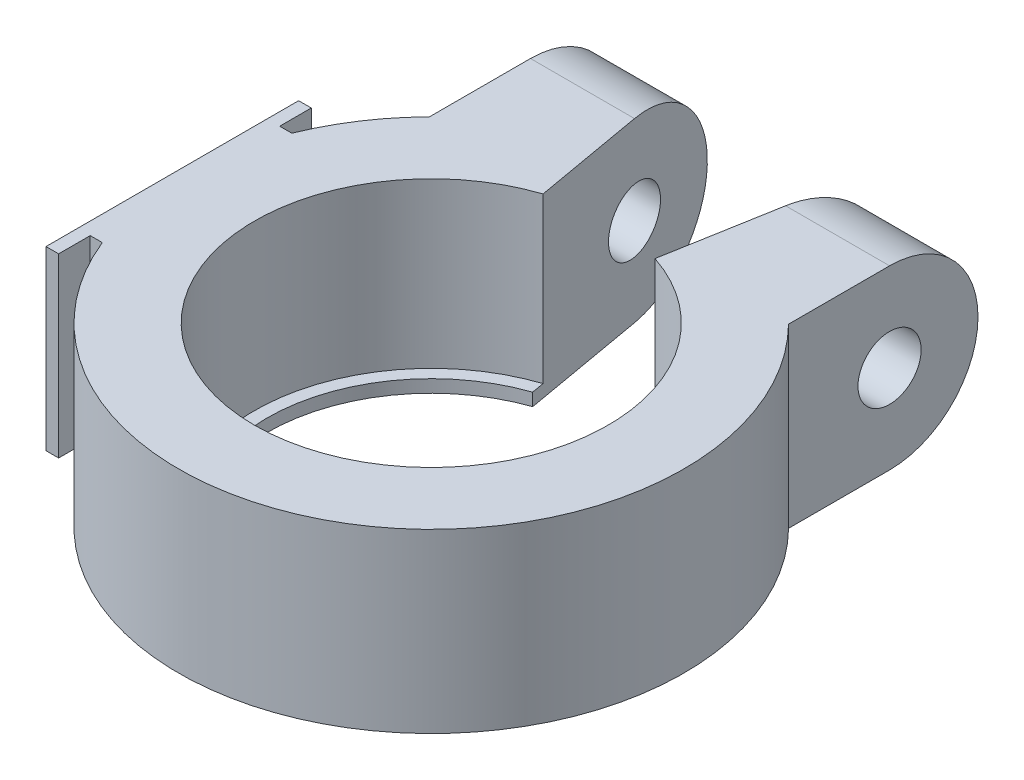
ISO-10303-21;
HEADER;
FILE_DESCRIPTION(('STEP AP214'),'2;1');
FILE_NAME('part.step','',(''),(''),'','','');
FILE_SCHEMA(('AUTOMOTIVE_DESIGN { 1 0 10303 214 1 1 1 1 }'));
ENDSEC;
DATA;
#1=APPLICATION_CONTEXT('core data for automotive mechanical design processes');
#2=APPLICATION_PROTOCOL_DEFINITION('international standard','automotive_design',2000,#1);
#3=PRODUCT_CONTEXT('',#1,'mechanical');
#4=PRODUCT('Part','Part','',(#3));
#5=PRODUCT_RELATED_PRODUCT_CATEGORY('part','',(#4));
#6=PRODUCT_DEFINITION_FORMATION('','',#4);
#7=PRODUCT_DEFINITION_CONTEXT('part definition',#1,'design');
#8=PRODUCT_DEFINITION('design','',#6,#7);
#9=PRODUCT_DEFINITION_SHAPE('','',#8);
#10=(LENGTH_UNIT() NAMED_UNIT(*) SI_UNIT(.MILLI.,.METRE.));
#11=(NAMED_UNIT(*) PLANE_ANGLE_UNIT() SI_UNIT($,.RADIAN.));
#12=(NAMED_UNIT(*) SI_UNIT($,.STERADIAN.) SOLID_ANGLE_UNIT());
#13=UNCERTAINTY_MEASURE_WITH_UNIT(LENGTH_MEASURE(1.E-05),#10,'distance_accuracy_value','');
#14=(GEOMETRIC_REPRESENTATION_CONTEXT(3) GLOBAL_UNCERTAINTY_ASSIGNED_CONTEXT((#13)) GLOBAL_UNIT_ASSIGNED_CONTEXT((#10,
#11,#12)) REPRESENTATION_CONTEXT('',''));
#15=CARTESIAN_POINT('',(0.,0.,0.));
#16=DIRECTION('',(0.,0.,1.));
#17=DIRECTION('',(1.,0.,0.));
#18=AXIS2_PLACEMENT_3D('',#15,#16,#17);
#19=CARTESIAN_POINT('',(0.,14.,0.));
#20=DIRECTION('',(0.,-1.,0.));
#21=DIRECTION('',(0.,0.,-1.));
#22=AXIS2_PLACEMENT_3D('',#19,#20,#21);
#23=CYLINDRICAL_SURFACE('',#22,13.);
#24=CARTESIAN_POINT('',(0.,1.,0.));
#25=DIRECTION('',(0.,1.,0.));
#26=DIRECTION('',(0.,0.,1.));
#27=AXIS2_PLACEMENT_3D('',#24,#25,#26);
#28=CIRCLE('',#27,13.);
#29=CARTESIAN_POINT('',(4.25438035283981,1.,-12.284146197981));
#30=VERTEX_POINT('',#29);
#31=CARTESIAN_POINT('',(-4.25438035283981,1.,-12.284146197981));
#32=VERTEX_POINT('',#31);
#33=EDGE_CURVE('E296',#30,#32,#28,.F.);
#34=ORIENTED_EDGE('',*,*,#33,.F.);
#35=DIRECTION('',(0.,-1.,0.));
#36=VECTOR('',#35,1.);
#37=CARTESIAN_POINT('',(4.25438035283981,14.,-12.284146197981));
#38=LINE('',#37,#36);
#39=CARTESIAN_POINT('',(4.25438035283981,0.,-12.284146197981));
#40=VERTEX_POINT('',#39);
#41=EDGE_CURVE('E194',#30,#40,#38,.T.);
#42=ORIENTED_EDGE('',*,*,#41,.T.);
#43=CARTESIAN_POINT('',(0.,0.,0.));
#44=DIRECTION('',(0.,-1.,0.));
#45=DIRECTION('',(0.,0.,1.));
#46=AXIS2_PLACEMENT_3D('',#43,#44,#45);
#47=CIRCLE('',#46,13.);
#48=CARTESIAN_POINT('',(-4.25438035283981,0.,-12.284146197981));
#49=VERTEX_POINT('',#48);
#50=EDGE_CURVE('E303',#40,#49,#47,.T.);
#51=ORIENTED_EDGE('',*,*,#50,.T.);
#52=DIRECTION('',(0.,-1.,0.));
#53=VECTOR('',#52,1.);
#54=CARTESIAN_POINT('',(-4.25438035283981,14.,-12.284146197981));
#55=LINE('',#54,#53);
#56=EDGE_CURVE('E249',#32,#49,#55,.T.);
#57=ORIENTED_EDGE('',*,*,#56,.F.);
#58=EDGE_LOOP('',(#34,#42,#51,#57));
#59=FACE_BOUND('',#58,.T.);
#60=ADVANCED_FACE('F47',(#59),#23,.F.);
#61=CARTESIAN_POINT('',(-5.97984896225347,7.,-22.0697649528697));
#62=DIRECTION('',(-1.,0.,0.));
#63=DIRECTION('',(0.,0.,1.));
#64=AXIS2_PLACEMENT_3D('',#61,#62,#63);
#65=CYLINDRICAL_SURFACE('',#64,7.);
#66=DIRECTION('',(1.,0.,0.));
#67=VECTOR('',#66,1.);
#68=CARTESIAN_POINT('',(-5.97984896225347,14.,-22.0697649528697));
#69=LINE('',#68,#67);
#70=CARTESIAN_POINT('',(-5.97984896225347,14.,-22.0697649528697));
#71=VERTEX_POINT('',#70);
#72=CARTESIAN_POINT('',(-14.2141378272127,14.,-22.0697649528697));
#73=VERTEX_POINT('',#72);
#74=EDGE_CURVE('E266',#71,#73,#69,.F.);
#75=ORIENTED_EDGE('',*,*,#74,.F.);
#76=CARTESIAN_POINT('',(-5.97984896225347,7.,-22.0697649528697));
#77=DIRECTION('',(-0.984807753012208,0.,0.173648177666931));
#78=DIRECTION('',(-0.173648177666931,0.,-0.984807753012208));
#79=AXIS2_PLACEMENT_3D('',#76,#77,#78);
#80=ELLIPSE('',#79,7.10798628320021,7.);
#81=CARTESIAN_POINT('',(-5.97984896225347,0.,-22.0697649528697));
#82=VERTEX_POINT('',#81);
#83=EDGE_CURVE('E72',#82,#71,#80,.F.);
#84=ORIENTED_EDGE('',*,*,#83,.F.);
#85=DIRECTION('',(-1.,0.,0.));
#86=VECTOR('',#85,1.);
#87=CARTESIAN_POINT('',(0.,0.,-22.0697649528697));
#88=LINE('',#87,#86);
#89=CARTESIAN_POINT('',(-14.2141378272127,0.,-22.0697649528697));
#90=VERTEX_POINT('',#89);
#91=EDGE_CURVE('E270',#90,#82,#88,.F.);
#92=ORIENTED_EDGE('',*,*,#91,.F.);
#93=CARTESIAN_POINT('',(-14.2141378272127,7.,-22.0697649528697));
#94=DIRECTION('',(1.,0.,0.));
#95=DIRECTION('',(0.,0.,-1.));
#96=AXIS2_PLACEMENT_3D('',#93,#94,#95);
#97=CIRCLE('',#96,7.);
#98=EDGE_CURVE('E275',#73,#90,#97,.F.);
#99=ORIENTED_EDGE('',*,*,#98,.F.);
#100=EDGE_LOOP('',(#75,#84,#92,#99));
#101=FACE_BOUND('',#100,.T.);
#102=ADVANCED_FACE('F50',(#101),#65,.T.);
#103=CARTESIAN_POINT('',(14.2141378272127,7.,-22.0697649528697));
#104=DIRECTION('',(-1.,0.,0.));
#105=DIRECTION('',(0.,0.,1.));
#106=AXIS2_PLACEMENT_3D('',#103,#104,#105);
#107=CYLINDRICAL_SURFACE('',#106,7.);
#108=DIRECTION('',(1.,0.,0.));
#109=VECTOR('',#108,1.);
#110=CARTESIAN_POINT('',(14.2141378272127,14.,-22.0697649528697));
#111=LINE('',#110,#109);
#112=CARTESIAN_POINT('',(14.2141378272127,14.,-22.0697649528697));
#113=VERTEX_POINT('',#112);
#114=CARTESIAN_POINT('',(5.97984896225347,14.,-22.0697649528697));
#115=VERTEX_POINT('',#114);
#116=EDGE_CURVE('E252',#113,#115,#111,.F.);
#117=ORIENTED_EDGE('',*,*,#116,.F.);
#118=CARTESIAN_POINT('',(14.2141378272127,7.,-22.0697649528697));
#119=DIRECTION('',(-1.,0.,0.));
#120=DIRECTION('',(0.,0.,1.));
#121=AXIS2_PLACEMENT_3D('',#118,#119,#120);
#122=CIRCLE('',#121,7.);
#123=CARTESIAN_POINT('',(14.2141378272127,0.,-22.0697649528697));
#124=VERTEX_POINT('',#123);
#125=EDGE_CURVE('E260',#124,#113,#122,.F.);
#126=ORIENTED_EDGE('',*,*,#125,.F.);
#127=DIRECTION('',(-1.,0.,0.));
#128=VECTOR('',#127,1.);
#129=CARTESIAN_POINT('',(0.,0.,-22.0697649528697));
#130=LINE('',#129,#128);
#131=CARTESIAN_POINT('',(5.97984896225347,0.,-22.0697649528697));
#132=VERTEX_POINT('',#131);
#133=EDGE_CURVE('E256',#132,#124,#130,.F.);
#134=ORIENTED_EDGE('',*,*,#133,.F.);
#135=CARTESIAN_POINT('',(5.97984896225347,7.,-22.0697649528697));
#136=DIRECTION('',(0.984807753012208,0.,0.173648177666931));
#137=DIRECTION('',(-0.173648177666931,0.,0.984807753012208));
#138=AXIS2_PLACEMENT_3D('',#135,#136,#137);
#139=ELLIPSE('',#138,7.10798628320021,7.);
#140=EDGE_CURVE('E263',#115,#132,#139,.F.);
#141=ORIENTED_EDGE('',*,*,#140,.F.);
#142=EDGE_LOOP('',(#117,#126,#134,#141));
#143=FACE_BOUND('',#142,.T.);
#144=ADVANCED_FACE('F392',(#143),#107,.T.);
#145=CARTESIAN_POINT('',(-4.25438035283981,14.,-12.284146197981));
#146=DIRECTION('',(-0.984807753012208,0.,0.173648177666931));
#147=DIRECTION('',(0.173648177666931,0.,0.984807753012208));
#148=AXIS2_PLACEMENT_3D('',#145,#146,#147);
#149=PLANE('',#148);
#150=CARTESIAN_POINT('',(-5.97984896225347,7.,-22.0697649528697));
#151=DIRECTION('',(-0.984807753012208,0.,0.173648177666931));
#152=DIRECTION('',(-0.173648177666931,0.,-0.984807753012208));
#153=AXIS2_PLACEMENT_3D('',#150,#151,#152);
#154=ELLIPSE('',#153,2.53856652971436,2.5);
#155=CARTESIAN_POINT('',(-6.42066641402464,7.,-24.5697649528697));
#156=VERTEX_POINT('',#155);
#157=EDGE_CURVE('E289',#156,#156,#154,.T.);
#158=ORIENTED_EDGE('',*,*,#157,.T.);
#159=EDGE_LOOP('',(#158));
#160=FACE_BOUND('',#159,.T.);
#161=DIRECTION('',(-0.173648177666931,0.,-0.984807753012208));
#162=VECTOR('',#161,1.);
#163=CARTESIAN_POINT('',(-4.25438035283981,14.,-12.284146197981));
#164=LINE('',#163,#162);
#165=CARTESIAN_POINT('',(-4.43008227345805,14.,-13.2806013060551));
#166=VERTEX_POINT('',#165);
#167=EDGE_CURVE('E304',#166,#71,#164,.T.);
#168=ORIENTED_EDGE('',*,*,#167,.F.);
#169=DIRECTION('',(0.,1.,0.));
#170=VECTOR('',#169,1.);
#171=CARTESIAN_POINT('',(-4.43008227345805,1.,-13.2806013060551));
#172=LINE('',#171,#170);
#173=CARTESIAN_POINT('',(-4.43008227345805,1.,-13.2806013060551));
#174=VERTEX_POINT('',#173);
#175=EDGE_CURVE('E64',#166,#174,#172,.F.);
#176=ORIENTED_EDGE('',*,*,#175,.T.);
#177=DIRECTION('',(-0.173648177666931,0.,-0.984807753012208));
#178=VECTOR('',#177,1.);
#179=CARTESIAN_POINT('',(-4.25438035283981,1.,-12.284146197981));
#180=LINE('',#179,#178);
#181=EDGE_CURVE('E188',#32,#174,#180,.T.);
#182=ORIENTED_EDGE('',*,*,#181,.F.);
#183=ORIENTED_EDGE('',*,*,#56,.T.);
#184=DIRECTION('',(-0.173648177666931,0.,-0.984807753012208));
#185=VECTOR('',#184,1.);
#186=CARTESIAN_POINT('',(-4.25438035283981,0.,-12.284146197981));
#187=LINE('',#186,#185);
#188=EDGE_CURVE('E342',#49,#82,#187,.T.);
#189=ORIENTED_EDGE('',*,*,#188,.T.);
#190=ORIENTED_EDGE('',*,*,#83,.T.);
#191=EDGE_LOOP('',(#168,#176,#182,#183,#189,#190));
#192=FACE_BOUND('',#191,.T.);
#193=ADVANCED_FACE('F444',(#160,#192),#149,.F.);
#194=CARTESIAN_POINT('',(-14.2141378272127,14.,-29.0697649528697));
#195=DIRECTION('',(1.,0.,0.));
#196=DIRECTION('',(0.,0.,-1.));
#197=AXIS2_PLACEMENT_3D('',#194,#195,#196);
#198=PLANE('',#197);
#199=CARTESIAN_POINT('',(-14.2141378272127,7.,-22.0697649528697));
#200=DIRECTION('',(-1.,0.,0.));
#201=DIRECTION('',(0.,0.,1.));
#202=AXIS2_PLACEMENT_3D('',#199,#200,#201);
#203=CIRCLE('',#202,2.5);
#204=CARTESIAN_POINT('',(-14.2141378272127,7.,-19.5697649528697));
#205=VERTEX_POINT('',#204);
#206=EDGE_CURVE('E282',#205,#205,#203,.T.);
#207=ORIENTED_EDGE('',*,*,#206,.F.);
#208=EDGE_LOOP('',(#207));
#209=FACE_BOUND('',#208,.T.);
#210=DIRECTION('',(0.,0.,1.));
#211=VECTOR('',#210,1.);
#212=CARTESIAN_POINT('',(-14.2141378272127,14.,-29.0697649528697));
#213=LINE('',#212,#211);
#214=CARTESIAN_POINT('',(-14.2141378272127,14.,-14.0697649528697));
#215=VERTEX_POINT('',#214);
#216=EDGE_CURVE('E307',#73,#215,#213,.T.);
#217=ORIENTED_EDGE('',*,*,#216,.F.);
#218=ORIENTED_EDGE('',*,*,#98,.T.);
#219=DIRECTION('',(0.,0.,1.));
#220=VECTOR('',#219,1.);
#221=CARTESIAN_POINT('',(-14.2141378272127,0.,-29.0697649528697));
#222=LINE('',#221,#220);
#223=CARTESIAN_POINT('',(-14.2141378272127,0.,-14.0697649528697));
#224=VERTEX_POINT('',#223);
#225=EDGE_CURVE('E346',#90,#224,#222,.T.);
#226=ORIENTED_EDGE('',*,*,#225,.T.);
#227=DIRECTION('',(0.,-1.,0.));
#228=VECTOR('',#227,1.);
#229=CARTESIAN_POINT('',(-14.2141378272127,14.,-14.0697649528697));
#230=LINE('',#229,#228);
#231=EDGE_CURVE('E245',#215,#224,#230,.T.);
#232=ORIENTED_EDGE('',*,*,#231,.F.);
#233=EDGE_LOOP('',(#217,#218,#226,#232));
#234=FACE_BOUND('',#233,.T.);
#235=ADVANCED_FACE('F440',(#209,#234),#198,.F.);
#236=CARTESIAN_POINT('',(0.,14.,0.));
#237=DIRECTION('',(0.,-1.,0.));
#238=DIRECTION('',(0.,0.,-1.));
#239=AXIS2_PLACEMENT_3D('',#236,#237,#238);
#240=CYLINDRICAL_SURFACE('',#239,20.);
#241=CARTESIAN_POINT('',(0.,0.,0.));
#242=DIRECTION('',(0.,1.,0.));
#243=DIRECTION('',(0.,0.,1.));
#244=AXIS2_PLACEMENT_3D('',#241,#242,#243);
#245=CIRCLE('',#244,20.);
#246=CARTESIAN_POINT('',(-18.5404962177392,0.,-7.5));
#247=VERTEX_POINT('',#246);
#248=EDGE_CURVE('E349',#224,#247,#245,.T.);
#249=ORIENTED_EDGE('',*,*,#248,.T.);
#250=DIRECTION('',(0.,-1.,0.));
#251=VECTOR('',#250,1.);
#252=CARTESIAN_POINT('',(-18.5404962177392,14.,-7.5));
#253=LINE('',#252,#251);
#254=CARTESIAN_POINT('',(-18.5404962177392,14.,-7.5));
#255=VERTEX_POINT('',#254);
#256=EDGE_CURVE('E241',#255,#247,#253,.T.);
#257=ORIENTED_EDGE('',*,*,#256,.F.);
#258=CARTESIAN_POINT('',(0.,14.,0.));
#259=DIRECTION('',(0.,1.,0.));
#260=DIRECTION('',(0.,0.,1.));
#261=AXIS2_PLACEMENT_3D('',#258,#259,#260);
#262=CIRCLE('',#261,20.);
#263=EDGE_CURVE('E310',#215,#255,#262,.T.);
#264=ORIENTED_EDGE('',*,*,#263,.F.);
#265=ORIENTED_EDGE('',*,*,#231,.T.);
#266=EDGE_LOOP('',(#249,#257,#264,#265));
#267=FACE_BOUND('',#266,.T.);
#268=ADVANCED_FACE('F435',(#267),#240,.T.);
#269=CARTESIAN_POINT('',(-19.5,14.,-7.5));
#270=DIRECTION('',(0.,0.,1.));
#271=DIRECTION('',(1.,0.,0.));
#272=AXIS2_PLACEMENT_3D('',#269,#270,#271);
#273=PLANE('',#272);
#274=DIRECTION('',(-1.,0.,0.));
#275=VECTOR('',#274,1.);
#276=CARTESIAN_POINT('',(-19.5,0.,-7.5));
#277=LINE('',#276,#275);
#278=CARTESIAN_POINT('',(-19.5,0.,-7.5));
#279=VERTEX_POINT('',#278);
#280=EDGE_CURVE('E352',#247,#279,#277,.T.);
#281=ORIENTED_EDGE('',*,*,#280,.T.);
#282=DIRECTION('',(0.,-1.,0.));
#283=VECTOR('',#282,1.);
#284=CARTESIAN_POINT('',(-19.5,14.,-7.5));
#285=LINE('',#284,#283);
#286=CARTESIAN_POINT('',(-19.5,14.,-7.5));
#287=VERTEX_POINT('',#286);
#288=EDGE_CURVE('E237',#287,#279,#285,.T.);
#289=ORIENTED_EDGE('',*,*,#288,.F.);
#290=DIRECTION('',(-1.,0.,0.));
#291=VECTOR('',#290,1.);
#292=CARTESIAN_POINT('',(-19.5,14.,-7.5));
#293=LINE('',#292,#291);
#294=EDGE_CURVE('E313',#255,#287,#293,.T.);
#295=ORIENTED_EDGE('',*,*,#294,.F.);
#296=ORIENTED_EDGE('',*,*,#256,.T.);
#297=EDGE_LOOP('',(#281,#289,#295,#296));
#298=FACE_BOUND('',#297,.T.);
#299=ADVANCED_FACE('F431',(#298),#273,.F.);
#300=CARTESIAN_POINT('',(-19.5,14.,-7.5));
#301=DIRECTION('',(-1.,0.,0.));
#302=DIRECTION('',(0.,0.,1.));
#303=AXIS2_PLACEMENT_3D('',#300,#301,#302);
#304=PLANE('',#303);
#305=DIRECTION('',(0.,0.,-1.));
#306=VECTOR('',#305,1.);
#307=CARTESIAN_POINT('',(-19.5,0.,-7.5));
#308=LINE('',#307,#306);
#309=CARTESIAN_POINT('',(-19.5,0.,-10.));
#310=VERTEX_POINT('',#309);
#311=EDGE_CURVE('E355',#279,#310,#308,.T.);
#312=ORIENTED_EDGE('',*,*,#311,.T.);
#313=DIRECTION('',(0.,-1.,0.));
#314=VECTOR('',#313,1.);
#315=CARTESIAN_POINT('',(-19.5,14.,-10.));
#316=LINE('',#315,#314);
#317=CARTESIAN_POINT('',(-19.5,14.,-10.));
#318=VERTEX_POINT('',#317);
#319=EDGE_CURVE('E233',#318,#310,#316,.T.);
#320=ORIENTED_EDGE('',*,*,#319,.F.);
#321=DIRECTION('',(0.,0.,-1.));
#322=VECTOR('',#321,1.);
#323=CARTESIAN_POINT('',(-19.5,14.,-7.5));
#324=LINE('',#323,#322);
#325=EDGE_CURVE('E316',#287,#318,#324,.T.);
#326=ORIENTED_EDGE('',*,*,#325,.F.);
#327=ORIENTED_EDGE('',*,*,#288,.T.);
#328=EDGE_LOOP('',(#312,#320,#326,#327));
#329=FACE_BOUND('',#328,.T.);
#330=ADVANCED_FACE('F427',(#329),#304,.F.);
#331=CARTESIAN_POINT('',(-19.5,14.,-10.));
#332=DIRECTION('',(0.,0.,1.));
#333=DIRECTION('',(1.,0.,0.));
#334=AXIS2_PLACEMENT_3D('',#331,#332,#333);
#335=PLANE('',#334);
#336=DIRECTION('',(-1.,0.,0.));
#337=VECTOR('',#336,1.);
#338=CARTESIAN_POINT('',(-19.5,0.,-10.));
#339=LINE('',#338,#337);
#340=CARTESIAN_POINT('',(-20.5,0.,-10.));
#341=VERTEX_POINT('',#340);
#342=EDGE_CURVE('E358',#310,#341,#339,.T.);
#343=ORIENTED_EDGE('',*,*,#342,.T.);
#344=DIRECTION('',(0.,-1.,0.));
#345=VECTOR('',#344,1.);
#346=CARTESIAN_POINT('',(-20.5,14.,-10.));
#347=LINE('',#346,#345);
#348=CARTESIAN_POINT('',(-20.5,14.,-10.));
#349=VERTEX_POINT('',#348);
#350=EDGE_CURVE('E229',#349,#341,#347,.T.);
#351=ORIENTED_EDGE('',*,*,#350,.F.);
#352=DIRECTION('',(-1.,0.,0.));
#353=VECTOR('',#352,1.);
#354=CARTESIAN_POINT('',(-19.5,14.,-10.));
#355=LINE('',#354,#353);
#356=EDGE_CURVE('E319',#318,#349,#355,.T.);
#357=ORIENTED_EDGE('',*,*,#356,.F.);
#358=ORIENTED_EDGE('',*,*,#319,.T.);
#359=EDGE_LOOP('',(#343,#351,#357,#358));
#360=FACE_BOUND('',#359,.T.);
#361=ADVANCED_FACE('F422',(#360),#335,.F.);
#362=CARTESIAN_POINT('',(-20.5,14.,-10.));
#363=DIRECTION('',(1.,0.,0.));
#364=DIRECTION('',(0.,0.,-1.));
#365=AXIS2_PLACEMENT_3D('',#362,#363,#364);
#366=PLANE('',#365);
#367=DIRECTION('',(0.,0.,1.));
#368=VECTOR('',#367,1.);
#369=CARTESIAN_POINT('',(-20.5,0.,-10.));
#370=LINE('',#369,#368);
#371=CARTESIAN_POINT('',(-20.5,0.,10.));
#372=VERTEX_POINT('',#371);
#373=EDGE_CURVE('E361',#341,#372,#370,.T.);
#374=ORIENTED_EDGE('',*,*,#373,.T.);
#375=DIRECTION('',(0.,-1.,0.));
#376=VECTOR('',#375,1.);
#377=CARTESIAN_POINT('',(-20.5,14.,10.));
#378=LINE('',#377,#376);
#379=CARTESIAN_POINT('',(-20.5,14.,10.));
#380=VERTEX_POINT('',#379);
#381=EDGE_CURVE('E225',#380,#372,#378,.T.);
#382=ORIENTED_EDGE('',*,*,#381,.F.);
#383=DIRECTION('',(0.,0.,1.));
#384=VECTOR('',#383,1.);
#385=CARTESIAN_POINT('',(-20.5,14.,-10.));
#386=LINE('',#385,#384);
#387=EDGE_CURVE('E322',#349,#380,#386,.T.);
#388=ORIENTED_EDGE('',*,*,#387,.F.);
#389=ORIENTED_EDGE('',*,*,#350,.T.);
#390=EDGE_LOOP('',(#374,#382,#388,#389));
#391=FACE_BOUND('',#390,.T.);
#392=ADVANCED_FACE('F416',(#391),#366,.F.);
#393=CARTESIAN_POINT('',(-19.5,14.,10.));
#394=DIRECTION('',(0.,0.,-1.));
#395=DIRECTION('',(-1.,0.,0.));
#396=AXIS2_PLACEMENT_3D('',#393,#394,#395);
#397=PLANE('',#396);
#398=DIRECTION('',(1.,0.,0.));
#399=VECTOR('',#398,1.);
#400=CARTESIAN_POINT('',(-19.5,0.,10.));
#401=LINE('',#400,#399);
#402=CARTESIAN_POINT('',(-19.5,0.,10.));
#403=VERTEX_POINT('',#402);
#404=EDGE_CURVE('E364',#372,#403,#401,.T.);
#405=ORIENTED_EDGE('',*,*,#404,.T.);
#406=DIRECTION('',(0.,-1.,0.));
#407=VECTOR('',#406,1.);
#408=CARTESIAN_POINT('',(-19.5,14.,10.));
#409=LINE('',#408,#407);
#410=CARTESIAN_POINT('',(-19.5,14.,10.));
#411=VERTEX_POINT('',#410);
#412=EDGE_CURVE('E221',#411,#403,#409,.T.);
#413=ORIENTED_EDGE('',*,*,#412,.F.);
#414=DIRECTION('',(1.,0.,0.));
#415=VECTOR('',#414,1.);
#416=CARTESIAN_POINT('',(-19.5,14.,10.));
#417=LINE('',#416,#415);
#418=EDGE_CURVE('E325',#380,#411,#417,.T.);
#419=ORIENTED_EDGE('',*,*,#418,.F.);
#420=ORIENTED_EDGE('',*,*,#381,.T.);
#421=EDGE_LOOP('',(#405,#413,#419,#420));
#422=FACE_BOUND('',#421,.T.);
#423=ADVANCED_FACE('F412',(#422),#397,.F.);
#424=CARTESIAN_POINT('',(-19.5,14.,10.));
#425=DIRECTION('',(-1.,0.,0.));
#426=DIRECTION('',(0.,0.,1.));
#427=AXIS2_PLACEMENT_3D('',#424,#425,#426);
#428=PLANE('',#427);
#429=DIRECTION('',(0.,0.,-1.));
#430=VECTOR('',#429,1.);
#431=CARTESIAN_POINT('',(-19.5,0.,10.));
#432=LINE('',#431,#430);
#433=CARTESIAN_POINT('',(-19.5,0.,7.5));
#434=VERTEX_POINT('',#433);
#435=EDGE_CURVE('E367',#403,#434,#432,.T.);
#436=ORIENTED_EDGE('',*,*,#435,.T.);
#437=DIRECTION('',(0.,-1.,0.));
#438=VECTOR('',#437,1.);
#439=CARTESIAN_POINT('',(-19.5,14.,7.5));
#440=LINE('',#439,#438);
#441=CARTESIAN_POINT('',(-19.5,14.,7.5));
#442=VERTEX_POINT('',#441);
#443=EDGE_CURVE('E217',#442,#434,#440,.T.);
#444=ORIENTED_EDGE('',*,*,#443,.F.);
#445=DIRECTION('',(0.,0.,-1.));
#446=VECTOR('',#445,1.);
#447=CARTESIAN_POINT('',(-19.5,14.,10.));
#448=LINE('',#447,#446);
#449=EDGE_CURVE('E328',#411,#442,#448,.T.);
#450=ORIENTED_EDGE('',*,*,#449,.F.);
#451=ORIENTED_EDGE('',*,*,#412,.T.);
#452=EDGE_LOOP('',(#436,#444,#450,#451));
#453=FACE_BOUND('',#452,.T.);
#454=ADVANCED_FACE('F407',(#453),#428,.F.);
#455=CARTESIAN_POINT('',(-19.5,14.,7.5));
#456=DIRECTION('',(0.,0.,-1.));
#457=DIRECTION('',(-1.,0.,0.));
#458=AXIS2_PLACEMENT_3D('',#455,#456,#457);
#459=PLANE('',#458);
#460=DIRECTION('',(1.,0.,0.));
#461=VECTOR('',#460,1.);
#462=CARTESIAN_POINT('',(-19.5,0.,7.5));
#463=LINE('',#462,#461);
#464=CARTESIAN_POINT('',(-18.5404962177392,0.,7.49999999999999));
#465=VERTEX_POINT('',#464);
#466=EDGE_CURVE('E370',#434,#465,#463,.T.);
#467=ORIENTED_EDGE('',*,*,#466,.T.);
#468=DIRECTION('',(0.,-1.,0.));
#469=VECTOR('',#468,1.);
#470=CARTESIAN_POINT('',(-18.5404962177392,14.,7.49999999999999));
#471=LINE('',#470,#469);
#472=CARTESIAN_POINT('',(-18.5404962177392,14.,7.49999999999999));
#473=VERTEX_POINT('',#472);
#474=EDGE_CURVE('E207',#473,#465,#471,.T.);
#475=ORIENTED_EDGE('',*,*,#474,.F.);
#476=DIRECTION('',(1.,0.,0.));
#477=VECTOR('',#476,1.);
#478=CARTESIAN_POINT('',(-19.5,14.,7.5));
#479=LINE('',#478,#477);
#480=EDGE_CURVE('E331',#442,#473,#479,.T.);
#481=ORIENTED_EDGE('',*,*,#480,.F.);
#482=ORIENTED_EDGE('',*,*,#443,.T.);
#483=EDGE_LOOP('',(#467,#475,#481,#482));
#484=FACE_BOUND('',#483,.T.);
#485=ADVANCED_FACE('F401',(#484),#459,.F.);
#486=CARTESIAN_POINT('',(0.,14.,0.));
#487=DIRECTION('',(0.,-1.,0.));
#488=DIRECTION('',(0.,0.,-1.));
#489=AXIS2_PLACEMENT_3D('',#486,#487,#488);
#490=CYLINDRICAL_SURFACE('',#489,20.);
#491=CARTESIAN_POINT('',(0.,0.,0.));
#492=DIRECTION('',(0.,1.,0.));
#493=DIRECTION('',(0.,0.,1.));
#494=AXIS2_PLACEMENT_3D('',#491,#492,#493);
#495=CIRCLE('',#494,20.);
#496=CARTESIAN_POINT('',(14.2141378272127,0.,-14.0697649528697));
#497=VERTEX_POINT('',#496);
#498=EDGE_CURVE('E373',#465,#497,#495,.T.);
#499=ORIENTED_EDGE('',*,*,#498,.T.);
#500=DIRECTION('',(0.,-1.,0.));
#501=VECTOR('',#500,1.);
#502=CARTESIAN_POINT('',(14.2141378272127,14.,-14.0697649528697));
#503=LINE('',#502,#501);
#504=CARTESIAN_POINT('',(14.2141378272127,14.,-14.0697649528697));
#505=VERTEX_POINT('',#504);
#506=EDGE_CURVE('E201',#505,#497,#503,.T.);
#507=ORIENTED_EDGE('',*,*,#506,.F.);
#508=CARTESIAN_POINT('',(0.,14.,0.));
#509=DIRECTION('',(0.,1.,0.));
#510=DIRECTION('',(0.,0.,1.));
#511=AXIS2_PLACEMENT_3D('',#508,#509,#510);
#512=CIRCLE('',#511,20.);
#513=EDGE_CURVE('E334',#473,#505,#512,.T.);
#514=ORIENTED_EDGE('',*,*,#513,.F.);
#515=ORIENTED_EDGE('',*,*,#474,.T.);
#516=EDGE_LOOP('',(#499,#507,#514,#515));
#517=FACE_BOUND('',#516,.T.);
#518=ADVANCED_FACE('F399',(#517),#490,.T.);
#519=CARTESIAN_POINT('',(14.2141378272127,14.,-29.0697649528697));
#520=DIRECTION('',(-1.,0.,0.));
#521=DIRECTION('',(0.,0.,1.));
#522=AXIS2_PLACEMENT_3D('',#519,#520,#521);
#523=PLANE('',#522);
#524=CARTESIAN_POINT('',(14.2141378272127,7.,-22.0697649528697));
#525=DIRECTION('',(-1.,0.,0.));
#526=DIRECTION('',(0.,0.,1.));
#527=AXIS2_PLACEMENT_3D('',#524,#525,#526);
#528=CIRCLE('',#527,2.5);
#529=CARTESIAN_POINT('',(14.2141378272127,7.,-19.5697649528697));
#530=VERTEX_POINT('',#529);
#531=EDGE_CURVE('E281',#530,#530,#528,.T.);
#532=ORIENTED_EDGE('',*,*,#531,.T.);
#533=EDGE_LOOP('',(#532));
#534=FACE_BOUND('',#533,.T.);
#535=DIRECTION('',(0.,0.,-1.));
#536=VECTOR('',#535,1.);
#537=CARTESIAN_POINT('',(14.2141378272127,0.,-29.0697649528697));
#538=LINE('',#537,#536);
#539=EDGE_CURVE('E375',#497,#124,#538,.T.);
#540=ORIENTED_EDGE('',*,*,#539,.T.);
#541=ORIENTED_EDGE('',*,*,#125,.T.);
#542=DIRECTION('',(0.,0.,-1.));
#543=VECTOR('',#542,1.);
#544=CARTESIAN_POINT('',(14.2141378272127,14.,-29.0697649528697));
#545=LINE('',#544,#543);
#546=EDGE_CURVE('E209',#505,#113,#545,.T.);
#547=ORIENTED_EDGE('',*,*,#546,.F.);
#548=ORIENTED_EDGE('',*,*,#506,.T.);
#549=EDGE_LOOP('',(#540,#541,#547,#548));
#550=FACE_BOUND('',#549,.T.);
#551=ADVANCED_FACE('F381',(#534,#550),#523,.F.);
#552=CARTESIAN_POINT('',(4.25438035283981,14.,-12.284146197981));
#553=DIRECTION('',(0.984807753012208,0.,0.173648177666931));
#554=DIRECTION('',(0.173648177666931,0.,-0.984807753012208));
#555=AXIS2_PLACEMENT_3D('',#552,#553,#554);
#556=PLANE('',#555);
#557=CARTESIAN_POINT('',(5.97984896225347,7.,-22.0697649528697));
#558=DIRECTION('',(0.984807753012208,0.,0.173648177666931));
#559=DIRECTION('',(-0.173648177666931,0.,0.984807753012208));
#560=AXIS2_PLACEMENT_3D('',#557,#558,#559);
#561=ELLIPSE('',#560,2.53856652971436,2.5);
#562=CARTESIAN_POINT('',(5.5390315104823,7.,-19.5697649528697));
#563=VERTEX_POINT('',#562);
#564=EDGE_CURVE('E278',#563,#563,#561,.T.);
#565=ORIENTED_EDGE('',*,*,#564,.T.);
#566=EDGE_LOOP('',(#565));
#567=FACE_BOUND('',#566,.T.);
#568=DIRECTION('',(-0.173648177666931,0.,0.984807753012208));
#569=VECTOR('',#568,1.);
#570=CARTESIAN_POINT('',(4.25438035283981,1.,-12.284146197981));
#571=LINE('',#570,#569);
#572=CARTESIAN_POINT('',(4.43008227345805,1.,-13.2806013060551));
#573=VERTEX_POINT('',#572);
#574=EDGE_CURVE('E11',#573,#30,#571,.T.);
#575=ORIENTED_EDGE('',*,*,#574,.F.);
#576=DIRECTION('',(0.,1.,0.));
#577=VECTOR('',#576,1.);
#578=CARTESIAN_POINT('',(4.43008227345805,1.,-13.2806013060551));
#579=LINE('',#578,#577);
#580=CARTESIAN_POINT('',(4.43008227345805,14.,-13.2806013060551));
#581=VERTEX_POINT('',#580);
#582=EDGE_CURVE('E174',#573,#581,#579,.T.);
#583=ORIENTED_EDGE('',*,*,#582,.T.);
#584=DIRECTION('',(-0.173648177666931,0.,0.984807753012208));
#585=VECTOR('',#584,1.);
#586=CARTESIAN_POINT('',(4.25438035283981,14.,-12.284146197981));
#587=LINE('',#586,#585);
#588=EDGE_CURVE('E202',#115,#581,#587,.T.);
#589=ORIENTED_EDGE('',*,*,#588,.F.);
#590=ORIENTED_EDGE('',*,*,#140,.T.);
#591=DIRECTION('',(-0.173648177666931,0.,0.984807753012208));
#592=VECTOR('',#591,1.);
#593=CARTESIAN_POINT('',(4.25438035283981,0.,-12.284146197981));
#594=LINE('',#593,#592);
#595=EDGE_CURVE('E196',#132,#40,#594,.T.);
#596=ORIENTED_EDGE('',*,*,#595,.T.);
#597=ORIENTED_EDGE('',*,*,#41,.F.);
#598=EDGE_LOOP('',(#575,#583,#589,#590,#596,#597));
#599=FACE_BOUND('',#598,.T.);
#600=ADVANCED_FACE('F192',(#567,#599),#556,.F.);
#601=CARTESIAN_POINT('',(0.,14.,0.));
#602=DIRECTION('',(0.,1.,0.));
#603=DIRECTION('',(0.,0.,1.));
#604=AXIS2_PLACEMENT_3D('',#601,#602,#603);
#605=PLANE('',#604);
#606=CARTESIAN_POINT('',(0.,14.,0.));
#607=DIRECTION('',(0.,1.,0.));
#608=DIRECTION('',(0.,0.,1.));
#609=AXIS2_PLACEMENT_3D('',#606,#607,#608);
#610=CIRCLE('',#609,14.);
#611=EDGE_CURVE('E57',#166,#581,#610,.T.);
#612=ORIENTED_EDGE('',*,*,#611,.F.);
#613=ORIENTED_EDGE('',*,*,#167,.T.);
#614=ORIENTED_EDGE('',*,*,#74,.T.);
#615=ORIENTED_EDGE('',*,*,#216,.T.);
#616=ORIENTED_EDGE('',*,*,#263,.T.);
#617=ORIENTED_EDGE('',*,*,#294,.T.);
#618=ORIENTED_EDGE('',*,*,#325,.T.);
#619=ORIENTED_EDGE('',*,*,#356,.T.);
#620=ORIENTED_EDGE('',*,*,#387,.T.);
#621=ORIENTED_EDGE('',*,*,#418,.T.);
#622=ORIENTED_EDGE('',*,*,#449,.T.);
#623=ORIENTED_EDGE('',*,*,#480,.T.);
#624=ORIENTED_EDGE('',*,*,#513,.T.);
#625=ORIENTED_EDGE('',*,*,#546,.T.);
#626=ORIENTED_EDGE('',*,*,#116,.T.);
#627=ORIENTED_EDGE('',*,*,#588,.T.);
#628=EDGE_LOOP('',(#612,#613,#614,#615,#616,#617,#618,#619,#620,#621,#622,#623,#624,#625,#626,#627));
#629=FACE_BOUND('',#628,.T.);
#630=ADVANCED_FACE('F394',(#629),#605,.T.);
#631=CARTESIAN_POINT('',(0.,0.,0.));
#632=DIRECTION('',(0.,1.,0.));
#633=DIRECTION('',(0.,0.,1.));
#634=AXIS2_PLACEMENT_3D('',#631,#632,#633);
#635=PLANE('',#634);
#636=ORIENTED_EDGE('',*,*,#225,.F.);
#637=ORIENTED_EDGE('',*,*,#91,.T.);
#638=ORIENTED_EDGE('',*,*,#188,.F.);
#639=ORIENTED_EDGE('',*,*,#50,.F.);
#640=ORIENTED_EDGE('',*,*,#595,.F.);
#641=ORIENTED_EDGE('',*,*,#133,.T.);
#642=ORIENTED_EDGE('',*,*,#539,.F.);
#643=ORIENTED_EDGE('',*,*,#498,.F.);
#644=ORIENTED_EDGE('',*,*,#466,.F.);
#645=ORIENTED_EDGE('',*,*,#435,.F.);
#646=ORIENTED_EDGE('',*,*,#404,.F.);
#647=ORIENTED_EDGE('',*,*,#373,.F.);
#648=ORIENTED_EDGE('',*,*,#342,.F.);
#649=ORIENTED_EDGE('',*,*,#311,.F.);
#650=ORIENTED_EDGE('',*,*,#280,.F.);
#651=ORIENTED_EDGE('',*,*,#248,.F.);
#652=EDGE_LOOP('',(#636,#637,#638,#639,#640,#641,#642,#643,#644,#645,#646,#647,#648,#649,#650,#651));
#653=FACE_BOUND('',#652,.T.);
#654=ADVANCED_FACE('F388',(#653),#635,.F.);
#655=CARTESIAN_POINT('',(20.,7.,-22.0697649528697));
#656=DIRECTION('',(-1.,0.,0.));
#657=DIRECTION('',(0.,0.,1.));
#658=AXIS2_PLACEMENT_3D('',#655,#656,#657);
#659=CYLINDRICAL_SURFACE('',#658,2.5);
#660=ORIENTED_EDGE('',*,*,#564,.F.);
#661=EDGE_LOOP('',(#660));
#662=FACE_BOUND('',#661,.T.);
#663=ORIENTED_EDGE('',*,*,#531,.F.);
#664=EDGE_LOOP('',(#663));
#665=FACE_BOUND('',#664,.T.);
#666=ADVANCED_FACE('F474',(#662,#665),#659,.F.);
#667=ORIENTED_EDGE('',*,*,#206,.T.);
#668=EDGE_LOOP('',(#667));
#669=FACE_BOUND('',#668,.T.);
#670=ORIENTED_EDGE('',*,*,#157,.F.);
#671=EDGE_LOOP('',(#670));
#672=FACE_BOUND('',#671,.T.);
#673=ADVANCED_FACE('F473',(#669,#672),#659,.F.);
#674=CARTESIAN_POINT('',(0.,1.,0.));
#675=DIRECTION('',(0.,1.,0.));
#676=DIRECTION('',(0.,0.,1.));
#677=AXIS2_PLACEMENT_3D('',#674,#675,#676);
#678=PLANE('',#677);
#679=ORIENTED_EDGE('',*,*,#181,.T.);
#680=CARTESIAN_POINT('',(0.,1.,0.));
#681=DIRECTION('',(0.,1.,0.));
#682=DIRECTION('',(0.,0.,1.));
#683=AXIS2_PLACEMENT_3D('',#680,#681,#682);
#684=CIRCLE('',#683,14.);
#685=EDGE_CURVE('E177',#174,#573,#684,.T.);
#686=ORIENTED_EDGE('',*,*,#685,.T.);
#687=ORIENTED_EDGE('',*,*,#574,.T.);
#688=ORIENTED_EDGE('',*,*,#33,.T.);
#689=EDGE_LOOP('',(#679,#686,#687,#688));
#690=FACE_BOUND('',#689,.T.);
#691=ADVANCED_FACE('F185',(#690),#678,.T.);
#692=CARTESIAN_POINT('',(0.,1.,0.));
#693=DIRECTION('',(0.,1.,0.));
#694=DIRECTION('',(0.,0.,1.));
#695=AXIS2_PLACEMENT_3D('',#692,#693,#694);
#696=CYLINDRICAL_SURFACE('',#695,14.);
#697=ORIENTED_EDGE('',*,*,#611,.T.);
#698=ORIENTED_EDGE('',*,*,#582,.F.);
#699=ORIENTED_EDGE('',*,*,#685,.F.);
#700=ORIENTED_EDGE('',*,*,#175,.F.);
#701=EDGE_LOOP('',(#697,#698,#699,#700));
#702=FACE_BOUND('',#701,.T.);
#703=ADVANCED_FACE('F176',(#702),#696,.F.);
#704=CLOSED_SHELL('',(#60,#102,#144,#193,#235,#268,#299,#330,#361,#392,#423,#454,#485,#518,#551,
#600,#630,#654,#666,#673,#691,#703));
#705=MANIFOLD_SOLID_BREP('B2',#704);
#706=ADVANCED_BREP_SHAPE_REPRESENTATION('',(#18,#705),#14);
#707=SHAPE_DEFINITION_REPRESENTATION(#9,#706);
ENDSEC;
END-ISO-10303-21;
